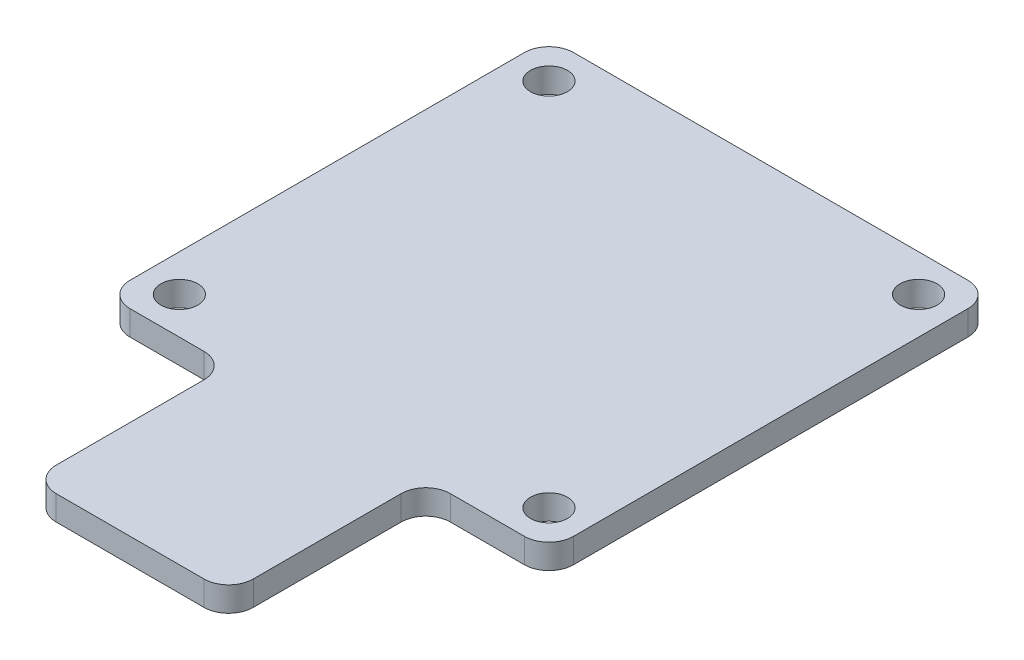
ISO-10303-21;
HEADER;
FILE_DESCRIPTION(('STEP AP214'),'2;1');
FILE_NAME('part.step','',(''),(''),'','','');
FILE_SCHEMA(('AUTOMOTIVE_DESIGN { 1 0 10303 214 1 1 1 1 }'));
ENDSEC;
DATA;
#1=APPLICATION_CONTEXT('core data for automotive mechanical design processes');
#2=APPLICATION_PROTOCOL_DEFINITION('international standard','automotive_design',2000,#1);
#3=PRODUCT_CONTEXT('',#1,'mechanical');
#4=PRODUCT('Part','Part','',(#3));
#5=PRODUCT_RELATED_PRODUCT_CATEGORY('part','',(#4));
#6=PRODUCT_DEFINITION_FORMATION('','',#4);
#7=PRODUCT_DEFINITION_CONTEXT('part definition',#1,'design');
#8=PRODUCT_DEFINITION('design','',#6,#7);
#9=PRODUCT_DEFINITION_SHAPE('','',#8);
#10=(LENGTH_UNIT() NAMED_UNIT(*) SI_UNIT(.MILLI.,.METRE.));
#11=(NAMED_UNIT(*) PLANE_ANGLE_UNIT() SI_UNIT($,.RADIAN.));
#12=(NAMED_UNIT(*) SI_UNIT($,.STERADIAN.) SOLID_ANGLE_UNIT());
#13=UNCERTAINTY_MEASURE_WITH_UNIT(LENGTH_MEASURE(1.E-05),#10,'distance_accuracy_value','');
#14=(GEOMETRIC_REPRESENTATION_CONTEXT(3) GLOBAL_UNCERTAINTY_ASSIGNED_CONTEXT((#13)) GLOBAL_UNIT_ASSIGNED_CONTEXT((#10,
#11,#12)) REPRESENTATION_CONTEXT('',''));
#15=CARTESIAN_POINT('',(0.,0.,0.));
#16=DIRECTION('',(0.,0.,1.));
#17=DIRECTION('',(1.,0.,0.));
#18=AXIS2_PLACEMENT_3D('',#15,#16,#17);
#19=CARTESIAN_POINT('',(0.,2.,0.));
#20=DIRECTION('',(0.,-1.,0.));
#21=DIRECTION('',(0.,0.,-1.));
#22=AXIS2_PLACEMENT_3D('',#19,#20,#21);
#23=PLANE('',#22);
#24=DIRECTION('',(-1.,0.,0.));
#25=VECTOR('',#24,1.);
#26=CARTESIAN_POINT('',(-18.,2.,-18.));
#27=LINE('',#26,#25);
#28=CARTESIAN_POINT('',(16.,2.,-18.));
#29=VERTEX_POINT('',#28);
#30=CARTESIAN_POINT('',(-16.,2.,-18.));
#31=VERTEX_POINT('',#30);
#32=EDGE_CURVE('E342',#29,#31,#27,.T.);
#33=ORIENTED_EDGE('',*,*,#32,.T.);
#34=CARTESIAN_POINT('',(-16.,2.,-16.));
#35=DIRECTION('',(0.,-1.,0.));
#36=DIRECTION('',(0.,0.,-1.));
#37=AXIS2_PLACEMENT_3D('',#34,#35,#36);
#38=CIRCLE('',#37,2.);
#39=CARTESIAN_POINT('',(-18.,2.,-16.));
#40=VERTEX_POINT('',#39);
#41=EDGE_CURVE('E242',#31,#40,#38,.F.);
#42=ORIENTED_EDGE('',*,*,#41,.T.);
#43=DIRECTION('',(0.,0.,1.));
#44=VECTOR('',#43,1.);
#45=CARTESIAN_POINT('',(-18.,2.,-18.));
#46=LINE('',#45,#44);
#47=CARTESIAN_POINT('',(-18.,2.,16.));
#48=VERTEX_POINT('',#47);
#49=EDGE_CURVE('E175',#40,#48,#46,.T.);
#50=ORIENTED_EDGE('',*,*,#49,.T.);
#51=CARTESIAN_POINT('',(-16.,2.,16.));
#52=DIRECTION('',(0.,-1.,0.));
#53=DIRECTION('',(0.,0.,-1.));
#54=AXIS2_PLACEMENT_3D('',#51,#52,#53);
#55=CIRCLE('',#54,2.);
#56=CARTESIAN_POINT('',(-16.,2.,18.));
#57=VERTEX_POINT('',#56);
#58=EDGE_CURVE('E228',#48,#57,#55,.F.);
#59=ORIENTED_EDGE('',*,*,#58,.T.);
#60=DIRECTION('',(1.,0.,0.));
#61=VECTOR('',#60,1.);
#62=CARTESIAN_POINT('',(-18.,2.,18.));
#63=LINE('',#62,#61);
#64=CARTESIAN_POINT('',(-9.99999999999974,2.,18.));
#65=VERTEX_POINT('',#64);
#66=EDGE_CURVE('E309',#57,#65,#63,.T.);
#67=ORIENTED_EDGE('',*,*,#66,.T.);
#68=CARTESIAN_POINT('',(-9.99999999999975,2.,20.));
#69=DIRECTION('',(0.,-1.,0.));
#70=DIRECTION('',(0.,0.,-1.));
#71=AXIS2_PLACEMENT_3D('',#68,#69,#70);
#72=CIRCLE('',#71,2.);
#73=CARTESIAN_POINT('',(-7.99999999999975,2.,20.));
#74=VERTEX_POINT('',#73);
#75=EDGE_CURVE('E11',#65,#74,#72,.T.);
#76=ORIENTED_EDGE('',*,*,#75,.T.);
#77=DIRECTION('',(0.,0.,1.));
#78=VECTOR('',#77,1.);
#79=CARTESIAN_POINT('',(-7.99999999999965,2.,34.));
#80=LINE('',#79,#78);
#81=CARTESIAN_POINT('',(-7.99999999999966,2.,32.0000000000001));
#82=VERTEX_POINT('',#81);
#83=EDGE_CURVE('E307',#74,#82,#80,.T.);
#84=ORIENTED_EDGE('',*,*,#83,.T.);
#85=CARTESIAN_POINT('',(-5.99999999999966,2.,32.));
#86=DIRECTION('',(0.,-1.,0.));
#87=DIRECTION('',(0.,0.,-1.));
#88=AXIS2_PLACEMENT_3D('',#85,#86,#87);
#89=CIRCLE('',#88,2.);
#90=CARTESIAN_POINT('',(-5.99999999999966,2.,34.));
#91=VERTEX_POINT('',#90);
#92=EDGE_CURVE('E231',#82,#91,#89,.F.);
#93=ORIENTED_EDGE('',*,*,#92,.T.);
#94=DIRECTION('',(1.,0.,0.));
#95=VECTOR('',#94,1.);
#96=CARTESIAN_POINT('',(8.00000000000001,2.,34.));
#97=LINE('',#96,#95);
#98=CARTESIAN_POINT('',(6.00000000000001,2.,34.));
#99=VERTEX_POINT('',#98);
#100=EDGE_CURVE('E314',#91,#99,#97,.T.);
#101=ORIENTED_EDGE('',*,*,#100,.T.);
#102=CARTESIAN_POINT('',(6.00000000000001,2.,32.));
#103=DIRECTION('',(0.,-1.,0.));
#104=DIRECTION('',(0.,0.,-1.));
#105=AXIS2_PLACEMENT_3D('',#102,#103,#104);
#106=CIRCLE('',#105,2.);
#107=CARTESIAN_POINT('',(8.00000000000001,2.,32.));
#108=VERTEX_POINT('',#107);
#109=EDGE_CURVE('E62',#99,#108,#106,.F.);
#110=ORIENTED_EDGE('',*,*,#109,.T.);
#111=DIRECTION('',(0.,0.,-1.));
#112=VECTOR('',#111,1.);
#113=CARTESIAN_POINT('',(8.00000000000001,2.,34.));
#114=LINE('',#113,#112);
#115=CARTESIAN_POINT('',(8.00000000000001,2.,20.));
#116=VERTEX_POINT('',#115);
#117=EDGE_CURVE('E208',#108,#116,#114,.T.);
#118=ORIENTED_EDGE('',*,*,#117,.T.);
#119=CARTESIAN_POINT('',(10.,2.,20.));
#120=DIRECTION('',(0.,-1.,0.));
#121=DIRECTION('',(0.,0.,-1.));
#122=AXIS2_PLACEMENT_3D('',#119,#120,#121);
#123=CIRCLE('',#122,2.);
#124=CARTESIAN_POINT('',(10.,2.,18.));
#125=VERTEX_POINT('',#124);
#126=EDGE_CURVE('E289',#116,#125,#123,.T.);
#127=ORIENTED_EDGE('',*,*,#126,.T.);
#128=DIRECTION('',(1.,0.,0.));
#129=VECTOR('',#128,1.);
#130=CARTESIAN_POINT('',(8.00000000000001,2.,18.));
#131=LINE('',#130,#129);
#132=CARTESIAN_POINT('',(16.,2.,18.));
#133=VERTEX_POINT('',#132);
#134=EDGE_CURVE('E206',#125,#133,#131,.T.);
#135=ORIENTED_EDGE('',*,*,#134,.T.);
#136=CARTESIAN_POINT('',(16.,2.,16.));
#137=DIRECTION('',(0.,-1.,0.));
#138=DIRECTION('',(0.,0.,-1.));
#139=AXIS2_PLACEMENT_3D('',#136,#137,#138);
#140=CIRCLE('',#139,2.);
#141=CARTESIAN_POINT('',(18.,2.,16.));
#142=VERTEX_POINT('',#141);
#143=EDGE_CURVE('E236',#133,#142,#140,.F.);
#144=ORIENTED_EDGE('',*,*,#143,.T.);
#145=DIRECTION('',(0.,0.,-1.));
#146=VECTOR('',#145,1.);
#147=CARTESIAN_POINT('',(18.,2.,-18.));
#148=LINE('',#147,#146);
#149=CARTESIAN_POINT('',(18.,2.,-16.));
#150=VERTEX_POINT('',#149);
#151=EDGE_CURVE('E343',#142,#150,#148,.T.);
#152=ORIENTED_EDGE('',*,*,#151,.T.);
#153=CARTESIAN_POINT('',(16.,2.,-16.));
#154=DIRECTION('',(0.,-1.,0.));
#155=DIRECTION('',(0.,0.,-1.));
#156=AXIS2_PLACEMENT_3D('',#153,#154,#155);
#157=CIRCLE('',#156,2.);
#158=EDGE_CURVE('E239',#150,#29,#157,.F.);
#159=ORIENTED_EDGE('',*,*,#158,.T.);
#160=EDGE_LOOP('',(#33,#42,#50,#59,#67,#76,#84,#93,#101,#110,#118,#127,#135,#144,#152,#159));
#161=FACE_BOUND('',#160,.T.);
#162=CARTESIAN_POINT('',(-15.,2.,-15.));
#163=DIRECTION('',(0.,1.,0.));
#164=DIRECTION('',(0.,0.,1.));
#165=AXIS2_PLACEMENT_3D('',#162,#163,#164);
#166=CIRCLE('',#165,1.5);
#167=CARTESIAN_POINT('',(-15.,2.,-13.5));
#168=VERTEX_POINT('',#167);
#169=EDGE_CURVE('E327',#168,#168,#166,.T.);
#170=ORIENTED_EDGE('',*,*,#169,.F.);
#171=EDGE_LOOP('',(#170));
#172=FACE_BOUND('',#171,.T.);
#173=CARTESIAN_POINT('',(15.,2.,-15.));
#174=DIRECTION('',(0.,1.,0.));
#175=DIRECTION('',(0.,0.,-1.));
#176=AXIS2_PLACEMENT_3D('',#173,#174,#175);
#177=CIRCLE('',#176,1.50000000000001);
#178=CARTESIAN_POINT('',(15.,2.,-16.5));
#179=VERTEX_POINT('',#178);
#180=EDGE_CURVE('E359',#179,#179,#177,.T.);
#181=ORIENTED_EDGE('',*,*,#180,.F.);
#182=EDGE_LOOP('',(#181));
#183=FACE_BOUND('',#182,.T.);
#184=CARTESIAN_POINT('',(15.,2.,15.));
#185=DIRECTION('',(0.,1.,0.));
#186=DIRECTION('',(0.,0.,1.));
#187=AXIS2_PLACEMENT_3D('',#184,#185,#186);
#188=CIRCLE('',#187,1.50000000000002);
#189=CARTESIAN_POINT('',(15.,2.,16.5));
#190=VERTEX_POINT('',#189);
#191=EDGE_CURVE('E367',#190,#190,#188,.T.);
#192=ORIENTED_EDGE('',*,*,#191,.F.);
#193=EDGE_LOOP('',(#192));
#194=FACE_BOUND('',#193,.T.);
#195=CARTESIAN_POINT('',(-15.,2.,15.));
#196=DIRECTION('',(0.,1.,0.));
#197=DIRECTION('',(0.,0.,-1.));
#198=AXIS2_PLACEMENT_3D('',#195,#196,#197);
#199=CIRCLE('',#198,1.5);
#200=CARTESIAN_POINT('',(-15.,2.,13.5));
#201=VERTEX_POINT('',#200);
#202=EDGE_CURVE('E375',#201,#201,#199,.T.);
#203=ORIENTED_EDGE('',*,*,#202,.F.);
#204=EDGE_LOOP('',(#203));
#205=FACE_BOUND('',#204,.T.);
#206=ADVANCED_FACE('F39',(#161,#172,#183,#194,#205),#23,.F.);
#207=CARTESIAN_POINT('',(0.,0.,0.));
#208=DIRECTION('',(0.,-1.,0.));
#209=DIRECTION('',(0.,0.,-1.));
#210=AXIS2_PLACEMENT_3D('',#207,#208,#209);
#211=PLANE('',#210);
#212=CARTESIAN_POINT('',(15.,0.,15.));
#213=DIRECTION('',(0.,1.,0.));
#214=DIRECTION('',(0.,0.,1.));
#215=AXIS2_PLACEMENT_3D('',#212,#213,#214);
#216=CIRCLE('',#215,1.50000000000002);
#217=CARTESIAN_POINT('',(15.,0.,16.5));
#218=VERTEX_POINT('',#217);
#219=EDGE_CURVE('E371',#218,#218,#216,.T.);
#220=ORIENTED_EDGE('',*,*,#219,.T.);
#221=EDGE_LOOP('',(#220));
#222=FACE_BOUND('',#221,.T.);
#223=CARTESIAN_POINT('',(-15.,0.,-15.));
#224=DIRECTION('',(0.,1.,0.));
#225=DIRECTION('',(0.,0.,1.));
#226=AXIS2_PLACEMENT_3D('',#223,#224,#225);
#227=CIRCLE('',#226,1.5);
#228=CARTESIAN_POINT('',(-15.,0.,-13.5));
#229=VERTEX_POINT('',#228);
#230=EDGE_CURVE('E355',#229,#229,#227,.T.);
#231=ORIENTED_EDGE('',*,*,#230,.T.);
#232=EDGE_LOOP('',(#231));
#233=FACE_BOUND('',#232,.T.);
#234=DIRECTION('',(0.,0.,1.));
#235=VECTOR('',#234,1.);
#236=CARTESIAN_POINT('',(-18.,0.,-18.));
#237=LINE('',#236,#235);
#238=CARTESIAN_POINT('',(-18.,0.,-16.));
#239=VERTEX_POINT('',#238);
#240=CARTESIAN_POINT('',(-18.,0.,16.));
#241=VERTEX_POINT('',#240);
#242=EDGE_CURVE('E172',#239,#241,#237,.T.);
#243=ORIENTED_EDGE('',*,*,#242,.F.);
#244=CARTESIAN_POINT('',(-16.,0.,-16.));
#245=DIRECTION('',(0.,-1.,0.));
#246=DIRECTION('',(0.,0.,-1.));
#247=AXIS2_PLACEMENT_3D('',#244,#245,#246);
#248=CIRCLE('',#247,2.);
#249=CARTESIAN_POINT('',(-16.,0.,-18.));
#250=VERTEX_POINT('',#249);
#251=EDGE_CURVE('E154',#239,#250,#248,.T.);
#252=ORIENTED_EDGE('',*,*,#251,.T.);
#253=DIRECTION('',(-1.,0.,0.));
#254=VECTOR('',#253,1.);
#255=CARTESIAN_POINT('',(-18.,0.,-18.));
#256=LINE('',#255,#254);
#257=CARTESIAN_POINT('',(16.,0.,-18.));
#258=VERTEX_POINT('',#257);
#259=EDGE_CURVE('E185',#258,#250,#256,.T.);
#260=ORIENTED_EDGE('',*,*,#259,.F.);
#261=CARTESIAN_POINT('',(16.,0.,-16.));
#262=DIRECTION('',(0.,-1.,0.));
#263=DIRECTION('',(0.,0.,-1.));
#264=AXIS2_PLACEMENT_3D('',#261,#262,#263);
#265=CIRCLE('',#264,2.);
#266=CARTESIAN_POINT('',(18.,0.,-16.));
#267=VERTEX_POINT('',#266);
#268=EDGE_CURVE('E166',#258,#267,#265,.T.);
#269=ORIENTED_EDGE('',*,*,#268,.T.);
#270=DIRECTION('',(0.,0.,-1.));
#271=VECTOR('',#270,1.);
#272=CARTESIAN_POINT('',(18.,0.,-18.));
#273=LINE('',#272,#271);
#274=CARTESIAN_POINT('',(18.,0.,16.));
#275=VERTEX_POINT('',#274);
#276=EDGE_CURVE('E192',#275,#267,#273,.T.);
#277=ORIENTED_EDGE('',*,*,#276,.F.);
#278=CARTESIAN_POINT('',(16.,0.,16.));
#279=DIRECTION('',(0.,-1.,0.));
#280=DIRECTION('',(0.,0.,-1.));
#281=AXIS2_PLACEMENT_3D('',#278,#279,#280);
#282=CIRCLE('',#281,2.);
#283=CARTESIAN_POINT('',(16.,0.,18.));
#284=VERTEX_POINT('',#283);
#285=EDGE_CURVE('E218',#275,#284,#282,.T.);
#286=ORIENTED_EDGE('',*,*,#285,.T.);
#287=DIRECTION('',(1.,0.,0.));
#288=VECTOR('',#287,1.);
#289=CARTESIAN_POINT('',(8.00000000000001,0.,18.));
#290=LINE('',#289,#288);
#291=CARTESIAN_POINT('',(10.,0.,18.));
#292=VERTEX_POINT('',#291);
#293=EDGE_CURVE('E324',#292,#284,#290,.T.);
#294=ORIENTED_EDGE('',*,*,#293,.F.);
#295=CARTESIAN_POINT('',(10.,0.,20.));
#296=DIRECTION('',(0.,-1.,0.));
#297=DIRECTION('',(0.,0.,-1.));
#298=AXIS2_PLACEMENT_3D('',#295,#296,#297);
#299=CIRCLE('',#298,2.);
#300=CARTESIAN_POINT('',(8.00000000000001,0.,20.));
#301=VERTEX_POINT('',#300);
#302=EDGE_CURVE('E286',#292,#301,#299,.F.);
#303=ORIENTED_EDGE('',*,*,#302,.T.);
#304=DIRECTION('',(0.,0.,-1.));
#305=VECTOR('',#304,1.);
#306=CARTESIAN_POINT('',(8.00000000000001,0.,34.));
#307=LINE('',#306,#305);
#308=CARTESIAN_POINT('',(8.00000000000001,0.,32.));
#309=VERTEX_POINT('',#308);
#310=EDGE_CURVE('E203',#309,#301,#307,.T.);
#311=ORIENTED_EDGE('',*,*,#310,.F.);
#312=CARTESIAN_POINT('',(6.00000000000001,0.,32.));
#313=DIRECTION('',(0.,-1.,0.));
#314=DIRECTION('',(0.,0.,-1.));
#315=AXIS2_PLACEMENT_3D('',#312,#313,#314);
#316=CIRCLE('',#315,2.);
#317=CARTESIAN_POINT('',(6.00000000000001,0.,34.));
#318=VERTEX_POINT('',#317);
#319=EDGE_CURVE('E215',#309,#318,#316,.T.);
#320=ORIENTED_EDGE('',*,*,#319,.T.);
#321=DIRECTION('',(1.,0.,0.));
#322=VECTOR('',#321,1.);
#323=CARTESIAN_POINT('',(8.00000000000001,0.,34.));
#324=LINE('',#323,#322);
#325=CARTESIAN_POINT('',(-5.99999999999966,0.,34.));
#326=VERTEX_POINT('',#325);
#327=EDGE_CURVE('E199',#326,#318,#324,.T.);
#328=ORIENTED_EDGE('',*,*,#327,.F.);
#329=CARTESIAN_POINT('',(-5.99999999999966,0.,32.));
#330=DIRECTION('',(0.,-1.,0.));
#331=DIRECTION('',(0.,0.,-1.));
#332=AXIS2_PLACEMENT_3D('',#329,#330,#331);
#333=CIRCLE('',#332,2.);
#334=CARTESIAN_POINT('',(-7.99999999999966,0.,32.0000000000001));
#335=VERTEX_POINT('',#334);
#336=EDGE_CURVE('E212',#326,#335,#333,.T.);
#337=ORIENTED_EDGE('',*,*,#336,.T.);
#338=DIRECTION('',(0.,0.,1.));
#339=VECTOR('',#338,1.);
#340=CARTESIAN_POINT('',(-7.99999999999965,0.,34.));
#341=LINE('',#340,#339);
#342=CARTESIAN_POINT('',(-7.99999999999975,0.,20.));
#343=VERTEX_POINT('',#342);
#344=EDGE_CURVE('E190',#343,#335,#341,.T.);
#345=ORIENTED_EDGE('',*,*,#344,.F.);
#346=CARTESIAN_POINT('',(-9.99999999999975,0.,20.));
#347=DIRECTION('',(0.,-1.,0.));
#348=DIRECTION('',(0.,0.,-1.));
#349=AXIS2_PLACEMENT_3D('',#346,#347,#348);
#350=CIRCLE('',#349,2.);
#351=CARTESIAN_POINT('',(-9.99999999999974,0.,18.));
#352=VERTEX_POINT('',#351);
#353=EDGE_CURVE('E48',#343,#352,#350,.F.);
#354=ORIENTED_EDGE('',*,*,#353,.T.);
#355=DIRECTION('',(1.,0.,0.));
#356=VECTOR('',#355,1.);
#357=CARTESIAN_POINT('',(-18.,0.,18.));
#358=LINE('',#357,#356);
#359=CARTESIAN_POINT('',(-16.,0.,18.));
#360=VERTEX_POINT('',#359);
#361=EDGE_CURVE('E184',#360,#352,#358,.T.);
#362=ORIENTED_EDGE('',*,*,#361,.F.);
#363=CARTESIAN_POINT('',(-16.,0.,16.));
#364=DIRECTION('',(0.,-1.,0.));
#365=DIRECTION('',(0.,0.,-1.));
#366=AXIS2_PLACEMENT_3D('',#363,#364,#365);
#367=CIRCLE('',#366,2.);
#368=EDGE_CURVE('E177',#360,#241,#367,.T.);
#369=ORIENTED_EDGE('',*,*,#368,.T.);
#370=EDGE_LOOP('',(#243,#252,#260,#269,#277,#286,#294,#303,#311,#320,#328,#337,#345,#354,#362,#369));
#371=FACE_BOUND('',#370,.T.);
#372=CARTESIAN_POINT('',(15.,0.,-15.));
#373=DIRECTION('',(0.,1.,0.));
#374=DIRECTION('',(0.,0.,-1.));
#375=AXIS2_PLACEMENT_3D('',#372,#373,#374);
#376=CIRCLE('',#375,1.50000000000001);
#377=CARTESIAN_POINT('',(15.,0.,-16.5));
#378=VERTEX_POINT('',#377);
#379=EDGE_CURVE('E363',#378,#378,#376,.T.);
#380=ORIENTED_EDGE('',*,*,#379,.T.);
#381=EDGE_LOOP('',(#380));
#382=FACE_BOUND('',#381,.T.);
#383=CARTESIAN_POINT('',(-15.,0.,15.));
#384=DIRECTION('',(0.,1.,0.));
#385=DIRECTION('',(0.,0.,-1.));
#386=AXIS2_PLACEMENT_3D('',#383,#384,#385);
#387=CIRCLE('',#386,1.5);
#388=CARTESIAN_POINT('',(-15.,0.,13.5));
#389=VERTEX_POINT('',#388);
#390=EDGE_CURVE('E379',#389,#389,#387,.T.);
#391=ORIENTED_EDGE('',*,*,#390,.T.);
#392=EDGE_LOOP('',(#391));
#393=FACE_BOUND('',#392,.T.);
#394=ADVANCED_FACE('F180',(#222,#233,#371,#382,#393),#211,.T.);
#395=CARTESIAN_POINT('',(8.00000000000001,2.,18.));
#396=DIRECTION('',(0.,0.,-1.));
#397=DIRECTION('',(-1.,0.,0.));
#398=AXIS2_PLACEMENT_3D('',#395,#396,#397);
#399=PLANE('',#398);
#400=ORIENTED_EDGE('',*,*,#293,.T.);
#401=DIRECTION('',(0.,-1.,0.));
#402=VECTOR('',#401,1.);
#403=CARTESIAN_POINT('',(16.,2.,18.));
#404=LINE('',#403,#402);
#405=EDGE_CURVE('E256',#284,#133,#404,.F.);
#406=ORIENTED_EDGE('',*,*,#405,.T.);
#407=ORIENTED_EDGE('',*,*,#134,.F.);
#408=DIRECTION('',(0.,-1.,0.));
#409=VECTOR('',#408,1.);
#410=CARTESIAN_POINT('',(10.,0.,18.));
#411=LINE('',#410,#409);
#412=EDGE_CURVE('E252',#125,#292,#411,.T.);
#413=ORIENTED_EDGE('',*,*,#412,.T.);
#414=EDGE_LOOP('',(#400,#406,#407,#413));
#415=FACE_BOUND('',#414,.T.);
#416=ADVANCED_FACE('F395',(#415),#399,.F.);
#417=CARTESIAN_POINT('',(18.,2.,-18.));
#418=DIRECTION('',(-1.,0.,0.));
#419=DIRECTION('',(0.,0.,1.));
#420=AXIS2_PLACEMENT_3D('',#417,#418,#419);
#421=PLANE('',#420);
#422=ORIENTED_EDGE('',*,*,#276,.T.);
#423=DIRECTION('',(0.,-1.,0.));
#424=VECTOR('',#423,1.);
#425=CARTESIAN_POINT('',(18.,2.,-16.));
#426=LINE('',#425,#424);
#427=EDGE_CURVE('E249',#267,#150,#426,.F.);
#428=ORIENTED_EDGE('',*,*,#427,.T.);
#429=ORIENTED_EDGE('',*,*,#151,.F.);
#430=DIRECTION('',(0.,-1.,0.));
#431=VECTOR('',#430,1.);
#432=CARTESIAN_POINT('',(18.,2.,16.));
#433=LINE('',#432,#431);
#434=EDGE_CURVE('E245',#142,#275,#433,.T.);
#435=ORIENTED_EDGE('',*,*,#434,.T.);
#436=EDGE_LOOP('',(#422,#428,#429,#435));
#437=FACE_BOUND('',#436,.T.);
#438=ADVANCED_FACE('F333',(#437),#421,.F.);
#439=CARTESIAN_POINT('',(-18.,2.,-18.));
#440=DIRECTION('',(0.,0.,1.));
#441=DIRECTION('',(1.,0.,0.));
#442=AXIS2_PLACEMENT_3D('',#439,#440,#441);
#443=PLANE('',#442);
#444=ORIENTED_EDGE('',*,*,#259,.T.);
#445=DIRECTION('',(0.,-1.,0.));
#446=VECTOR('',#445,1.);
#447=CARTESIAN_POINT('',(-16.,2.,-18.));
#448=LINE('',#447,#446);
#449=EDGE_CURVE('E159',#250,#31,#448,.F.);
#450=ORIENTED_EDGE('',*,*,#449,.T.);
#451=ORIENTED_EDGE('',*,*,#32,.F.);
#452=DIRECTION('',(0.,-1.,0.));
#453=VECTOR('',#452,1.);
#454=CARTESIAN_POINT('',(16.,2.,-18.));
#455=LINE('',#454,#453);
#456=EDGE_CURVE('E165',#29,#258,#455,.T.);
#457=ORIENTED_EDGE('',*,*,#456,.T.);
#458=EDGE_LOOP('',(#444,#450,#451,#457));
#459=FACE_BOUND('',#458,.T.);
#460=ADVANCED_FACE('F345',(#459),#443,.F.);
#461=CARTESIAN_POINT('',(-18.,2.,-18.));
#462=DIRECTION('',(1.,0.,0.));
#463=DIRECTION('',(0.,0.,-1.));
#464=AXIS2_PLACEMENT_3D('',#461,#462,#463);
#465=PLANE('',#464);
#466=ORIENTED_EDGE('',*,*,#49,.F.);
#467=DIRECTION('',(0.,-1.,0.));
#468=VECTOR('',#467,1.);
#469=CARTESIAN_POINT('',(-18.,2.,-16.));
#470=LINE('',#469,#468);
#471=EDGE_CURVE('E158',#40,#239,#470,.T.);
#472=ORIENTED_EDGE('',*,*,#471,.T.);
#473=ORIENTED_EDGE('',*,*,#242,.T.);
#474=DIRECTION('',(0.,-1.,0.));
#475=VECTOR('',#474,1.);
#476=CARTESIAN_POINT('',(-18.,2.,16.));
#477=LINE('',#476,#475);
#478=EDGE_CURVE('E178',#241,#48,#477,.F.);
#479=ORIENTED_EDGE('',*,*,#478,.T.);
#480=EDGE_LOOP('',(#466,#472,#473,#479));
#481=FACE_BOUND('',#480,.T.);
#482=ADVANCED_FACE('F171',(#481),#465,.F.);
#483=CARTESIAN_POINT('',(-18.,2.,18.));
#484=DIRECTION('',(0.,0.,-1.));
#485=DIRECTION('',(-1.,0.,0.));
#486=AXIS2_PLACEMENT_3D('',#483,#484,#485);
#487=PLANE('',#486);
#488=ORIENTED_EDGE('',*,*,#361,.T.);
#489=DIRECTION('',(0.,-1.,0.));
#490=VECTOR('',#489,1.);
#491=CARTESIAN_POINT('',(-9.99999999999974,2.,18.));
#492=LINE('',#491,#490);
#493=EDGE_CURVE('E283',#352,#65,#492,.F.);
#494=ORIENTED_EDGE('',*,*,#493,.T.);
#495=ORIENTED_EDGE('',*,*,#66,.F.);
#496=DIRECTION('',(0.,-1.,0.));
#497=VECTOR('',#496,1.);
#498=CARTESIAN_POINT('',(-16.,2.,18.));
#499=LINE('',#498,#497);
#500=EDGE_CURVE('E279',#57,#360,#499,.T.);
#501=ORIENTED_EDGE('',*,*,#500,.T.);
#502=EDGE_LOOP('',(#488,#494,#495,#501));
#503=FACE_BOUND('',#502,.T.);
#504=ADVANCED_FACE('F297',(#503),#487,.F.);
#505=CARTESIAN_POINT('',(-7.99999999999965,2.,34.));
#506=DIRECTION('',(1.,0.,0.));
#507=DIRECTION('',(0.,0.,-1.));
#508=AXIS2_PLACEMENT_3D('',#505,#506,#507);
#509=PLANE('',#508);
#510=ORIENTED_EDGE('',*,*,#344,.T.);
#511=DIRECTION('',(0.,-1.,0.));
#512=VECTOR('',#511,1.);
#513=CARTESIAN_POINT('',(-7.99999999999966,2.,32.0000000000001));
#514=LINE('',#513,#512);
#515=EDGE_CURVE('E276',#335,#82,#514,.F.);
#516=ORIENTED_EDGE('',*,*,#515,.T.);
#517=ORIENTED_EDGE('',*,*,#83,.F.);
#518=DIRECTION('',(0.,-1.,0.));
#519=VECTOR('',#518,1.);
#520=CARTESIAN_POINT('',(-7.99999999999975,0.,20.));
#521=LINE('',#520,#519);
#522=EDGE_CURVE('E272',#74,#343,#521,.T.);
#523=ORIENTED_EDGE('',*,*,#522,.T.);
#524=EDGE_LOOP('',(#510,#516,#517,#523));
#525=FACE_BOUND('',#524,.T.);
#526=ADVANCED_FACE('F311',(#525),#509,.F.);
#527=CARTESIAN_POINT('',(8.00000000000001,2.,34.));
#528=DIRECTION('',(0.,0.,-1.));
#529=DIRECTION('',(-1.,0.,0.));
#530=AXIS2_PLACEMENT_3D('',#527,#528,#529);
#531=PLANE('',#530);
#532=ORIENTED_EDGE('',*,*,#327,.T.);
#533=DIRECTION('',(0.,-1.,0.));
#534=VECTOR('',#533,1.);
#535=CARTESIAN_POINT('',(6.00000000000001,2.,34.));
#536=LINE('',#535,#534);
#537=EDGE_CURVE('E269',#318,#99,#536,.F.);
#538=ORIENTED_EDGE('',*,*,#537,.T.);
#539=ORIENTED_EDGE('',*,*,#100,.F.);
#540=DIRECTION('',(0.,-1.,0.));
#541=VECTOR('',#540,1.);
#542=CARTESIAN_POINT('',(-5.99999999999966,2.,34.));
#543=LINE('',#542,#541);
#544=EDGE_CURVE('E265',#91,#326,#543,.T.);
#545=ORIENTED_EDGE('',*,*,#544,.T.);
#546=EDGE_LOOP('',(#532,#538,#539,#545));
#547=FACE_BOUND('',#546,.T.);
#548=ADVANCED_FACE('F405',(#547),#531,.F.);
#549=CARTESIAN_POINT('',(8.00000000000001,2.,34.));
#550=DIRECTION('',(-1.,0.,0.));
#551=DIRECTION('',(0.,0.,1.));
#552=AXIS2_PLACEMENT_3D('',#549,#550,#551);
#553=PLANE('',#552);
#554=ORIENTED_EDGE('',*,*,#310,.T.);
#555=DIRECTION('',(0.,-1.,0.));
#556=VECTOR('',#555,1.);
#557=CARTESIAN_POINT('',(8.00000000000001,2.,20.));
#558=LINE('',#557,#556);
#559=EDGE_CURVE('E55',#301,#116,#558,.F.);
#560=ORIENTED_EDGE('',*,*,#559,.T.);
#561=ORIENTED_EDGE('',*,*,#117,.F.);
#562=DIRECTION('',(0.,-1.,0.));
#563=VECTOR('',#562,1.);
#564=CARTESIAN_POINT('',(8.00000000000001,2.,32.));
#565=LINE('',#564,#563);
#566=EDGE_CURVE('E259',#108,#309,#565,.T.);
#567=ORIENTED_EDGE('',*,*,#566,.T.);
#568=EDGE_LOOP('',(#554,#560,#561,#567));
#569=FACE_BOUND('',#568,.T.);
#570=ADVANCED_FACE('F402',(#569),#553,.F.);
#571=CARTESIAN_POINT('',(-15.,2.,-15.));
#572=DIRECTION('',(0.,-1.,0.));
#573=DIRECTION('',(0.,0.,-1.));
#574=AXIS2_PLACEMENT_3D('',#571,#572,#573);
#575=CYLINDRICAL_SURFACE('',#574,1.5);
#576=ORIENTED_EDGE('',*,*,#169,.T.);
#577=EDGE_LOOP('',(#576));
#578=FACE_BOUND('',#577,.T.);
#579=ORIENTED_EDGE('',*,*,#230,.F.);
#580=EDGE_LOOP('',(#579));
#581=FACE_BOUND('',#580,.T.);
#582=ADVANCED_FACE('F399',(#578,#581),#575,.F.);
#583=CARTESIAN_POINT('',(15.,2.,-15.));
#584=DIRECTION('',(0.,-1.,0.));
#585=DIRECTION('',(0.,0.,-1.));
#586=AXIS2_PLACEMENT_3D('',#583,#584,#585);
#587=CYLINDRICAL_SURFACE('',#586,1.50000000000001);
#588=ORIENTED_EDGE('',*,*,#180,.T.);
#589=EDGE_LOOP('',(#588));
#590=FACE_BOUND('',#589,.T.);
#591=ORIENTED_EDGE('',*,*,#379,.F.);
#592=EDGE_LOOP('',(#591));
#593=FACE_BOUND('',#592,.T.);
#594=ADVANCED_FACE('F567',(#590,#593),#587,.F.);
#595=CARTESIAN_POINT('',(15.,2.,15.));
#596=DIRECTION('',(0.,-1.,0.));
#597=DIRECTION('',(0.,0.,-1.));
#598=AXIS2_PLACEMENT_3D('',#595,#596,#597);
#599=CYLINDRICAL_SURFACE('',#598,1.50000000000002);
#600=ORIENTED_EDGE('',*,*,#191,.T.);
#601=EDGE_LOOP('',(#600));
#602=FACE_BOUND('',#601,.T.);
#603=ORIENTED_EDGE('',*,*,#219,.F.);
#604=EDGE_LOOP('',(#603));
#605=FACE_BOUND('',#604,.T.);
#606=ADVANCED_FACE('F558',(#602,#605),#599,.F.);
#607=CARTESIAN_POINT('',(-15.,2.,15.));
#608=DIRECTION('',(0.,-1.,0.));
#609=DIRECTION('',(0.,0.,-1.));
#610=AXIS2_PLACEMENT_3D('',#607,#608,#609);
#611=CYLINDRICAL_SURFACE('',#610,1.5);
#612=ORIENTED_EDGE('',*,*,#202,.T.);
#613=EDGE_LOOP('',(#612));
#614=FACE_BOUND('',#613,.T.);
#615=ORIENTED_EDGE('',*,*,#390,.F.);
#616=EDGE_LOOP('',(#615));
#617=FACE_BOUND('',#616,.T.);
#618=ADVANCED_FACE('F387',(#614,#617),#611,.F.);
#619=CARTESIAN_POINT('',(-16.,2.,-16.));
#620=DIRECTION('',(0.,-1.,0.));
#621=DIRECTION('',(0.,0.,-1.));
#622=AXIS2_PLACEMENT_3D('',#619,#620,#621);
#623=CYLINDRICAL_SURFACE('',#622,2.);
#624=ORIENTED_EDGE('',*,*,#41,.F.);
#625=ORIENTED_EDGE('',*,*,#449,.F.);
#626=ORIENTED_EDGE('',*,*,#251,.F.);
#627=ORIENTED_EDGE('',*,*,#471,.F.);
#628=EDGE_LOOP('',(#624,#625,#626,#627));
#629=FACE_BOUND('',#628,.T.);
#630=ADVANCED_FACE('F157',(#629),#623,.T.);
#631=CARTESIAN_POINT('',(16.,2.,-16.));
#632=DIRECTION('',(0.,-1.,0.));
#633=DIRECTION('',(0.,0.,-1.));
#634=AXIS2_PLACEMENT_3D('',#631,#632,#633);
#635=CYLINDRICAL_SURFACE('',#634,2.);
#636=ORIENTED_EDGE('',*,*,#158,.F.);
#637=ORIENTED_EDGE('',*,*,#427,.F.);
#638=ORIENTED_EDGE('',*,*,#268,.F.);
#639=ORIENTED_EDGE('',*,*,#456,.F.);
#640=EDGE_LOOP('',(#636,#637,#638,#639));
#641=FACE_BOUND('',#640,.T.);
#642=ADVANCED_FACE('F339',(#641),#635,.T.);
#643=CARTESIAN_POINT('',(16.,2.,16.));
#644=DIRECTION('',(0.,-1.,0.));
#645=DIRECTION('',(0.,0.,-1.));
#646=AXIS2_PLACEMENT_3D('',#643,#644,#645);
#647=CYLINDRICAL_SURFACE('',#646,2.);
#648=ORIENTED_EDGE('',*,*,#143,.F.);
#649=ORIENTED_EDGE('',*,*,#405,.F.);
#650=ORIENTED_EDGE('',*,*,#285,.F.);
#651=ORIENTED_EDGE('',*,*,#434,.F.);
#652=EDGE_LOOP('',(#648,#649,#650,#651));
#653=FACE_BOUND('',#652,.T.);
#654=ADVANCED_FACE('F426',(#653),#647,.T.);
#655=CARTESIAN_POINT('',(10.,2.,20.));
#656=DIRECTION('',(0.,1.,0.));
#657=DIRECTION('',(0.,0.,1.));
#658=AXIS2_PLACEMENT_3D('',#655,#656,#657);
#659=CYLINDRICAL_SURFACE('',#658,2.);
#660=ORIENTED_EDGE('',*,*,#126,.F.);
#661=ORIENTED_EDGE('',*,*,#559,.F.);
#662=ORIENTED_EDGE('',*,*,#302,.F.);
#663=ORIENTED_EDGE('',*,*,#412,.F.);
#664=EDGE_LOOP('',(#660,#661,#662,#663));
#665=FACE_BOUND('',#664,.T.);
#666=ADVANCED_FACE('F429',(#665),#659,.F.);
#667=CARTESIAN_POINT('',(6.00000000000001,2.,32.));
#668=DIRECTION('',(0.,-1.,0.));
#669=DIRECTION('',(0.,0.,-1.));
#670=AXIS2_PLACEMENT_3D('',#667,#668,#669);
#671=CYLINDRICAL_SURFACE('',#670,2.);
#672=ORIENTED_EDGE('',*,*,#109,.F.);
#673=ORIENTED_EDGE('',*,*,#537,.F.);
#674=ORIENTED_EDGE('',*,*,#319,.F.);
#675=ORIENTED_EDGE('',*,*,#566,.F.);
#676=EDGE_LOOP('',(#672,#673,#674,#675));
#677=FACE_BOUND('',#676,.T.);
#678=ADVANCED_FACE('F433',(#677),#671,.T.);
#679=CARTESIAN_POINT('',(-5.99999999999966,2.,32.));
#680=DIRECTION('',(0.,-1.,0.));
#681=DIRECTION('',(0.,0.,-1.));
#682=AXIS2_PLACEMENT_3D('',#679,#680,#681);
#683=CYLINDRICAL_SURFACE('',#682,2.);
#684=ORIENTED_EDGE('',*,*,#92,.F.);
#685=ORIENTED_EDGE('',*,*,#515,.F.);
#686=ORIENTED_EDGE('',*,*,#336,.F.);
#687=ORIENTED_EDGE('',*,*,#544,.F.);
#688=EDGE_LOOP('',(#684,#685,#686,#687));
#689=FACE_BOUND('',#688,.T.);
#690=ADVANCED_FACE('F437',(#689),#683,.T.);
#691=CARTESIAN_POINT('',(-9.99999999999975,2.,20.));
#692=DIRECTION('',(0.,1.,0.));
#693=DIRECTION('',(0.,0.,1.));
#694=AXIS2_PLACEMENT_3D('',#691,#692,#693);
#695=CYLINDRICAL_SURFACE('',#694,2.);
#696=ORIENTED_EDGE('',*,*,#75,.F.);
#697=ORIENTED_EDGE('',*,*,#493,.F.);
#698=ORIENTED_EDGE('',*,*,#353,.F.);
#699=ORIENTED_EDGE('',*,*,#522,.F.);
#700=EDGE_LOOP('',(#696,#697,#698,#699));
#701=FACE_BOUND('',#700,.T.);
#702=ADVANCED_FACE('F302',(#701),#695,.F.);
#703=CARTESIAN_POINT('',(-16.,2.,16.));
#704=DIRECTION('',(0.,-1.,0.));
#705=DIRECTION('',(0.,0.,-1.));
#706=AXIS2_PLACEMENT_3D('',#703,#704,#705);
#707=CYLINDRICAL_SURFACE('',#706,2.);
#708=ORIENTED_EDGE('',*,*,#58,.F.);
#709=ORIENTED_EDGE('',*,*,#478,.F.);
#710=ORIENTED_EDGE('',*,*,#368,.F.);
#711=ORIENTED_EDGE('',*,*,#500,.F.);
#712=EDGE_LOOP('',(#708,#709,#710,#711));
#713=FACE_BOUND('',#712,.T.);
#714=ADVANCED_FACE('F41',(#713),#707,.T.);
#715=CLOSED_SHELL('',(#206,#394,#416,#438,#460,#482,#504,#526,#548,#570,#582,#594,#606,#618,
#630,#642,#654,#666,#678,#690,#702,#714));
#716=MANIFOLD_SOLID_BREP('B2',#715);
#717=ADVANCED_BREP_SHAPE_REPRESENTATION('',(#18,#716),#14);
#718=SHAPE_DEFINITION_REPRESENTATION(#9,#717);
ENDSEC;
END-ISO-10303-21;
